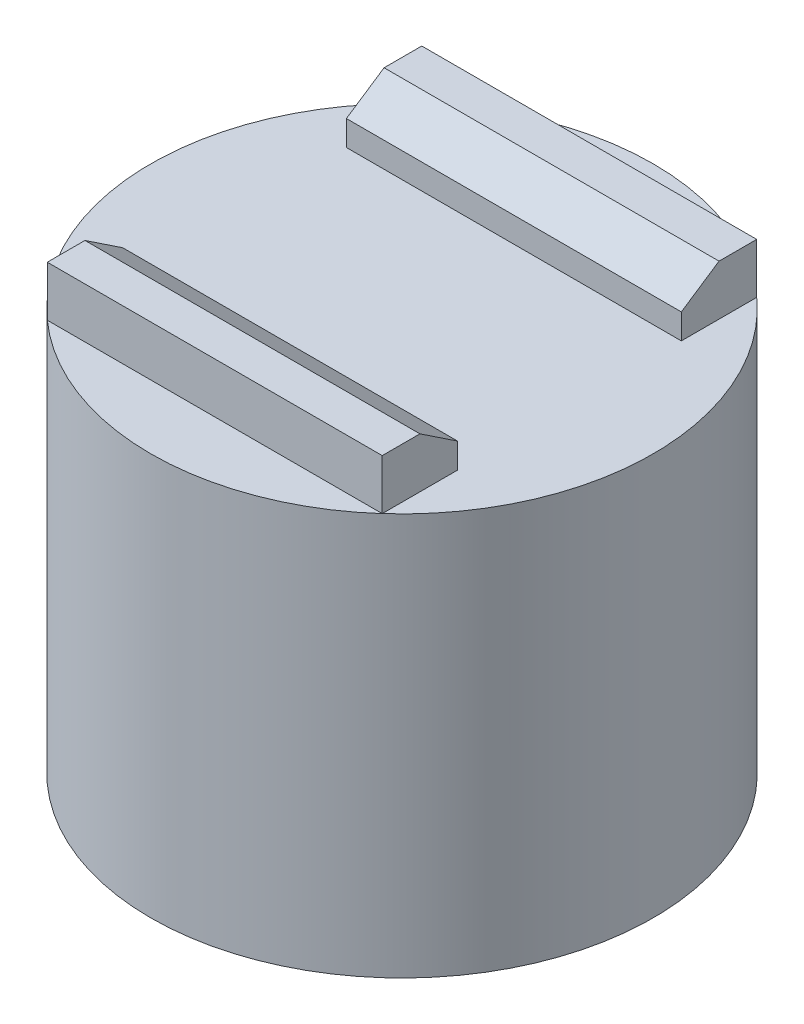
ISO-10303-21;
HEADER;
FILE_DESCRIPTION(('STEP AP214'),'2;1');
FILE_NAME('part.step','',(''),(''),'','','');
FILE_SCHEMA(('AUTOMOTIVE_DESIGN { 1 0 10303 214 1 1 1 1 }'));
ENDSEC;
DATA;
#1=APPLICATION_CONTEXT('core data for automotive mechanical design processes');
#2=APPLICATION_PROTOCOL_DEFINITION('international standard','automotive_design',2000,#1);
#3=PRODUCT_CONTEXT('',#1,'mechanical');
#4=PRODUCT('Part','Part','',(#3));
#5=PRODUCT_RELATED_PRODUCT_CATEGORY('part','',(#4));
#6=PRODUCT_DEFINITION_FORMATION('','',#4);
#7=PRODUCT_DEFINITION_CONTEXT('part definition',#1,'design');
#8=PRODUCT_DEFINITION('design','',#6,#7);
#9=PRODUCT_DEFINITION_SHAPE('','',#8);
#10=(LENGTH_UNIT() NAMED_UNIT(*) SI_UNIT(.MILLI.,.METRE.));
#11=(NAMED_UNIT(*) PLANE_ANGLE_UNIT() SI_UNIT($,.RADIAN.));
#12=(NAMED_UNIT(*) SI_UNIT($,.STERADIAN.) SOLID_ANGLE_UNIT());
#13=UNCERTAINTY_MEASURE_WITH_UNIT(LENGTH_MEASURE(1.E-05),#10,'distance_accuracy_value','');
#14=(GEOMETRIC_REPRESENTATION_CONTEXT(3) GLOBAL_UNCERTAINTY_ASSIGNED_CONTEXT((#13)) GLOBAL_UNIT_ASSIGNED_CONTEXT((#10,
#11,#12)) REPRESENTATION_CONTEXT('',''));
#15=CARTESIAN_POINT('',(0.,0.,0.));
#16=DIRECTION('',(0.,0.,1.));
#17=DIRECTION('',(1.,0.,0.));
#18=AXIS2_PLACEMENT_3D('',#15,#16,#17);
#19=CARTESIAN_POINT('',(0.,24.,0.));
#20=DIRECTION('',(0.,1.,0.));
#21=DIRECTION('',(0.,0.,1.));
#22=AXIS2_PLACEMENT_3D('',#19,#20,#21);
#23=PLANE('',#22);
#24=CARTESIAN_POINT('',(0.,24.,0.));
#25=DIRECTION('',(0.,1.,0.));
#26=DIRECTION('',(0.,0.,1.));
#27=AXIS2_PLACEMENT_3D('',#24,#25,#26);
#28=CIRCLE('',#27,15.);
#29=CARTESIAN_POINT('',(-10.,24.,-11.1803398874989));
#30=VERTEX_POINT('',#29);
#31=CARTESIAN_POINT('',(-10.,24.,11.1803398874989));
#32=VERTEX_POINT('',#31);
#33=EDGE_CURVE('E181',#30,#32,#28,.T.);
#34=ORIENTED_EDGE('',*,*,#33,.T.);
#35=DIRECTION('',(0.,0.,-1.));
#36=VECTOR('',#35,1.);
#37=CARTESIAN_POINT('',(-10.,24.,11.1803398874989));
#38=LINE('',#37,#36);
#39=CARTESIAN_POINT('',(-10.,24.,6.68033988749895));
#40=VERTEX_POINT('',#39);
#41=EDGE_CURVE('E48',#32,#40,#38,.T.);
#42=ORIENTED_EDGE('',*,*,#41,.T.);
#43=DIRECTION('',(1.,0.,0.));
#44=VECTOR('',#43,1.);
#45=CARTESIAN_POINT('',(-10.,24.,6.68033988749895));
#46=LINE('',#45,#44);
#47=CARTESIAN_POINT('',(10.,24.,6.68033988749895));
#48=VERTEX_POINT('',#47);
#49=EDGE_CURVE('E53',#40,#48,#46,.T.);
#50=ORIENTED_EDGE('',*,*,#49,.T.);
#51=DIRECTION('',(0.,0.,-1.));
#52=VECTOR('',#51,1.);
#53=CARTESIAN_POINT('',(10.,24.,11.1803398874989));
#54=LINE('',#53,#52);
#55=CARTESIAN_POINT('',(10.,24.,11.1803398874989));
#56=VERTEX_POINT('',#55);
#57=EDGE_CURVE('E132',#56,#48,#54,.T.);
#58=ORIENTED_EDGE('',*,*,#57,.F.);
#59=CARTESIAN_POINT('',(10.,24.,-11.1803398874989));
#60=VERTEX_POINT('',#59);
#61=EDGE_CURVE('E182',#56,#60,#28,.T.);
#62=ORIENTED_EDGE('',*,*,#61,.T.);
#63=DIRECTION('',(0.,0.,1.));
#64=VECTOR('',#63,1.);
#65=CARTESIAN_POINT('',(10.,24.,-11.1803398874989));
#66=LINE('',#65,#64);
#67=CARTESIAN_POINT('',(10.,24.,-6.68033988749895));
#68=VERTEX_POINT('',#67);
#69=EDGE_CURVE('E165',#60,#68,#66,.T.);
#70=ORIENTED_EDGE('',*,*,#69,.T.);
#71=DIRECTION('',(1.,0.,0.));
#72=VECTOR('',#71,1.);
#73=CARTESIAN_POINT('',(-10.,24.,-6.68033988749895));
#74=LINE('',#73,#72);
#75=CARTESIAN_POINT('',(-10.,24.,-6.68033988749895));
#76=VERTEX_POINT('',#75);
#77=EDGE_CURVE('E162',#76,#68,#74,.T.);
#78=ORIENTED_EDGE('',*,*,#77,.F.);
#79=DIRECTION('',(0.,0.,1.));
#80=VECTOR('',#79,1.);
#81=CARTESIAN_POINT('',(-10.,24.,-11.1803398874989));
#82=LINE('',#81,#80);
#83=EDGE_CURVE('E148',#30,#76,#82,.T.);
#84=ORIENTED_EDGE('',*,*,#83,.F.);
#85=EDGE_LOOP('',(#34,#42,#50,#58,#62,#70,#78,#84));
#86=FACE_BOUND('',#85,.T.);
#87=ADVANCED_FACE('F33',(#86),#23,.T.);
#88=EDGE_CURVE('E41',#60,#30,#28,.T.);
#89=ORIENTED_EDGE('',*,*,#88,.T.);
#90=DIRECTION('',(1.,0.,0.));
#91=VECTOR('',#90,1.);
#92=CARTESIAN_POINT('',(-10.,24.,-11.1803398874989));
#93=LINE('',#92,#91);
#94=EDGE_CURVE('E153',#30,#60,#93,.T.);
#95=ORIENTED_EDGE('',*,*,#94,.T.);
#96=EDGE_LOOP('',(#89,#95));
#97=FACE_BOUND('',#96,.T.);
#98=ADVANCED_FACE('F244',(#97),#23,.T.);
#99=CARTESIAN_POINT('',(0.,24.,0.));
#100=DIRECTION('',(0.,-1.,0.));
#101=DIRECTION('',(0.,0.,-1.));
#102=AXIS2_PLACEMENT_3D('',#99,#100,#101);
#103=CYLINDRICAL_SURFACE('',#102,15.);
#104=ORIENTED_EDGE('',*,*,#88,.F.);
#105=ORIENTED_EDGE('',*,*,#61,.F.);
#106=EDGE_CURVE('E186',#32,#56,#28,.T.);
#107=ORIENTED_EDGE('',*,*,#106,.F.);
#108=ORIENTED_EDGE('',*,*,#33,.F.);
#109=EDGE_LOOP('',(#104,#105,#107,#108));
#110=FACE_BOUND('',#109,.T.);
#111=CARTESIAN_POINT('',(0.,0.,0.));
#112=DIRECTION('',(0.,1.,0.));
#113=DIRECTION('',(0.,0.,1.));
#114=AXIS2_PLACEMENT_3D('',#111,#112,#113);
#115=CIRCLE('',#114,15.);
#116=CARTESIAN_POINT('',(0.,0.,15.));
#117=VERTEX_POINT('',#116);
#118=EDGE_CURVE('E179',#117,#117,#115,.T.);
#119=ORIENTED_EDGE('',*,*,#118,.T.);
#120=EDGE_LOOP('',(#119));
#121=FACE_BOUND('',#120,.T.);
#122=ADVANCED_FACE('F35',(#110,#121),#103,.T.);
#123=DIRECTION('',(1.,0.,0.));
#124=VECTOR('',#123,1.);
#125=CARTESIAN_POINT('',(-10.,24.,11.1803398874989));
#126=LINE('',#125,#124);
#127=EDGE_CURVE('E200',#32,#56,#126,.T.);
#128=ORIENTED_EDGE('',*,*,#127,.F.);
#129=ORIENTED_EDGE('',*,*,#106,.T.);
#130=EDGE_LOOP('',(#128,#129));
#131=FACE_BOUND('',#130,.T.);
#132=ADVANCED_FACE('F235',(#131),#23,.T.);
#133=CARTESIAN_POINT('',(0.,0.,0.));
#134=DIRECTION('',(0.,1.,0.));
#135=DIRECTION('',(0.,0.,1.));
#136=AXIS2_PLACEMENT_3D('',#133,#134,#135);
#137=PLANE('',#136);
#138=CARTESIAN_POINT('',(0.,0.,0.));
#139=DIRECTION('',(0.,-1.,0.));
#140=DIRECTION('',(0.,0.,-1.));
#141=AXIS2_PLACEMENT_3D('',#138,#139,#140);
#142=CIRCLE('',#141,2.5);
#143=CARTESIAN_POINT('',(0.,0.,-2.5));
#144=VERTEX_POINT('',#143);
#145=EDGE_CURVE('E217',#144,#144,#142,.T.);
#146=ORIENTED_EDGE('',*,*,#145,.F.);
#147=EDGE_LOOP('',(#146));
#148=FACE_BOUND('',#147,.T.);
#149=ORIENTED_EDGE('',*,*,#118,.F.);
#150=EDGE_LOOP('',(#149));
#151=FACE_BOUND('',#150,.T.);
#152=ADVANCED_FACE('F231',(#148,#151),#137,.F.);
#153=CARTESIAN_POINT('',(-10.,27.,-11.1803398874989));
#154=DIRECTION('',(1.,0.,0.));
#155=DIRECTION('',(0.,0.,-1.));
#156=AXIS2_PLACEMENT_3D('',#153,#154,#155);
#157=PLANE('',#156);
#158=DIRECTION('',(0.,-1.,0.));
#159=VECTOR('',#158,1.);
#160=CARTESIAN_POINT('',(-10.,27.,-6.68033988749895));
#161=LINE('',#160,#159);
#162=CARTESIAN_POINT('',(-10.,25.5,-6.68033988749896));
#163=VERTEX_POINT('',#162);
#164=EDGE_CURVE('E177',#163,#76,#161,.T.);
#165=ORIENTED_EDGE('',*,*,#164,.F.);
#166=DIRECTION('',(0.,0.554700196225229,-0.832050294337844));
#167=VECTOR('',#166,1.);
#168=CARTESIAN_POINT('',(-10.,28.0384615384615,-10.4880321951913));
#169=LINE('',#168,#167);
#170=CARTESIAN_POINT('',(-10.,27.,-8.93033988749895));
#171=VERTEX_POINT('',#170);
#172=EDGE_CURVE('E145',#163,#171,#169,.T.);
#173=ORIENTED_EDGE('',*,*,#172,.T.);
#174=DIRECTION('',(0.,0.,1.));
#175=VECTOR('',#174,1.);
#176=CARTESIAN_POINT('',(-10.,27.,-11.1803398874989));
#177=LINE('',#176,#175);
#178=CARTESIAN_POINT('',(-10.,27.,-11.1803398874989));
#179=VERTEX_POINT('',#178);
#180=EDGE_CURVE('E149',#179,#171,#177,.T.);
#181=ORIENTED_EDGE('',*,*,#180,.F.);
#182=DIRECTION('',(0.,-1.,0.));
#183=VECTOR('',#182,1.);
#184=CARTESIAN_POINT('',(-10.,27.,-11.1803398874989));
#185=LINE('',#184,#183);
#186=EDGE_CURVE('E159',#179,#30,#185,.T.);
#187=ORIENTED_EDGE('',*,*,#186,.T.);
#188=ORIENTED_EDGE('',*,*,#83,.T.);
#189=EDGE_LOOP('',(#165,#173,#181,#187,#188));
#190=FACE_BOUND('',#189,.T.);
#191=ADVANCED_FACE('F234',(#190),#157,.F.);
#192=CARTESIAN_POINT('',(-10.,27.,-6.68033988749895));
#193=DIRECTION('',(0.,0.,-1.));
#194=DIRECTION('',(-1.,0.,0.));
#195=AXIS2_PLACEMENT_3D('',#192,#193,#194);
#196=PLANE('',#195);
#197=DIRECTION('',(0.,-1.,0.));
#198=VECTOR('',#197,1.);
#199=CARTESIAN_POINT('',(10.,27.,-6.68033988749895));
#200=LINE('',#199,#198);
#201=CARTESIAN_POINT('',(10.,25.5,-6.68033988749895));
#202=VERTEX_POINT('',#201);
#203=EDGE_CURVE('E175',#202,#68,#200,.T.);
#204=ORIENTED_EDGE('',*,*,#203,.F.);
#205=DIRECTION('',(1.,0.,0.));
#206=VECTOR('',#205,1.);
#207=CARTESIAN_POINT('',(-33.,25.5,-6.68033988749896));
#208=LINE('',#207,#206);
#209=EDGE_CURVE('E143',#163,#202,#208,.T.);
#210=ORIENTED_EDGE('',*,*,#209,.F.);
#211=ORIENTED_EDGE('',*,*,#164,.T.);
#212=ORIENTED_EDGE('',*,*,#77,.T.);
#213=EDGE_LOOP('',(#204,#210,#211,#212));
#214=FACE_BOUND('',#213,.T.);
#215=ADVANCED_FACE('F240',(#214),#196,.F.);
#216=CARTESIAN_POINT('',(10.,27.,-11.1803398874989));
#217=DIRECTION('',(1.,0.,0.));
#218=DIRECTION('',(0.,0.,-1.));
#219=AXIS2_PLACEMENT_3D('',#216,#217,#218);
#220=PLANE('',#219);
#221=DIRECTION('',(0.,0.554700196225229,-0.832050294337844));
#222=VECTOR('',#221,1.);
#223=CARTESIAN_POINT('',(10.,25.5,-6.68033988749895));
#224=LINE('',#223,#222);
#225=CARTESIAN_POINT('',(10.,27.,-8.93033988749895));
#226=VERTEX_POINT('',#225);
#227=EDGE_CURVE('E141',#202,#226,#224,.T.);
#228=ORIENTED_EDGE('',*,*,#227,.F.);
#229=ORIENTED_EDGE('',*,*,#203,.T.);
#230=ORIENTED_EDGE('',*,*,#69,.F.);
#231=DIRECTION('',(0.,-1.,0.));
#232=VECTOR('',#231,1.);
#233=CARTESIAN_POINT('',(10.,27.,-11.1803398874989));
#234=LINE('',#233,#232);
#235=CARTESIAN_POINT('',(10.,27.,-11.1803398874989));
#236=VERTEX_POINT('',#235);
#237=EDGE_CURVE('E172',#236,#60,#234,.T.);
#238=ORIENTED_EDGE('',*,*,#237,.F.);
#239=DIRECTION('',(0.,0.,1.));
#240=VECTOR('',#239,1.);
#241=CARTESIAN_POINT('',(10.,27.,-11.1803398874989));
#242=LINE('',#241,#240);
#243=EDGE_CURVE('E152',#236,#226,#242,.T.);
#244=ORIENTED_EDGE('',*,*,#243,.T.);
#245=EDGE_LOOP('',(#228,#229,#230,#238,#244));
#246=FACE_BOUND('',#245,.T.);
#247=ADVANCED_FACE('F253',(#246),#220,.T.);
#248=CARTESIAN_POINT('',(-10.,27.,-11.1803398874989));
#249=DIRECTION('',(0.,0.,-1.));
#250=DIRECTION('',(-1.,0.,0.));
#251=AXIS2_PLACEMENT_3D('',#248,#249,#250);
#252=PLANE('',#251);
#253=ORIENTED_EDGE('',*,*,#94,.F.);
#254=ORIENTED_EDGE('',*,*,#186,.F.);
#255=DIRECTION('',(1.,0.,0.));
#256=VECTOR('',#255,1.);
#257=CARTESIAN_POINT('',(-10.,27.,-11.1803398874989));
#258=LINE('',#257,#256);
#259=EDGE_CURVE('E156',#179,#236,#258,.T.);
#260=ORIENTED_EDGE('',*,*,#259,.T.);
#261=ORIENTED_EDGE('',*,*,#237,.T.);
#262=EDGE_LOOP('',(#253,#254,#260,#261));
#263=FACE_BOUND('',#262,.T.);
#264=ADVANCED_FACE('F257',(#263),#252,.T.);
#265=CARTESIAN_POINT('',(0.,27.,0.));
#266=DIRECTION('',(0.,1.,0.));
#267=DIRECTION('',(0.,0.,1.));
#268=AXIS2_PLACEMENT_3D('',#265,#266,#267);
#269=PLANE('',#268);
#270=DIRECTION('',(-1.,0.,0.));
#271=VECTOR('',#270,1.);
#272=CARTESIAN_POINT('',(0.,27.,-8.93033988749895));
#273=LINE('',#272,#271);
#274=EDGE_CURVE('E11',#226,#171,#273,.T.);
#275=ORIENTED_EDGE('',*,*,#274,.F.);
#276=ORIENTED_EDGE('',*,*,#243,.F.);
#277=ORIENTED_EDGE('',*,*,#259,.F.);
#278=ORIENTED_EDGE('',*,*,#180,.T.);
#279=EDGE_LOOP('',(#275,#276,#277,#278));
#280=FACE_BOUND('',#279,.T.);
#281=ADVANCED_FACE('F261',(#280),#269,.T.);
#282=CARTESIAN_POINT('',(-33.,25.5,-6.68033988749896));
#283=DIRECTION('',(0.,-0.832050294337844,-0.554700196225229));
#284=DIRECTION('',(0.,0.554700196225229,-0.832050294337844));
#285=AXIS2_PLACEMENT_3D('',#282,#283,#284);
#286=PLANE('',#285);
#287=ORIENTED_EDGE('',*,*,#209,.T.);
#288=ORIENTED_EDGE('',*,*,#227,.T.);
#289=ORIENTED_EDGE('',*,*,#274,.T.);
#290=ORIENTED_EDGE('',*,*,#172,.F.);
#291=EDGE_LOOP('',(#287,#288,#289,#290));
#292=FACE_BOUND('',#291,.T.);
#293=ADVANCED_FACE('F265',(#292),#286,.F.);
#294=CARTESIAN_POINT('',(-10.,27.,11.1803398874989));
#295=DIRECTION('',(1.,0.,0.));
#296=DIRECTION('',(0.,0.,1.));
#297=AXIS2_PLACEMENT_3D('',#294,#295,#296);
#298=PLANE('',#297);
#299=DIRECTION('',(0.,-1.,0.));
#300=VECTOR('',#299,1.);
#301=CARTESIAN_POINT('',(-10.,27.,6.68033988749895));
#302=LINE('',#301,#300);
#303=CARTESIAN_POINT('',(-10.,25.5,6.68033988749896));
#304=VERTEX_POINT('',#303);
#305=EDGE_CURVE('E127',#304,#40,#302,.T.);
#306=ORIENTED_EDGE('',*,*,#305,.T.);
#307=ORIENTED_EDGE('',*,*,#41,.F.);
#308=DIRECTION('',(0.,-1.,0.));
#309=VECTOR('',#308,1.);
#310=CARTESIAN_POINT('',(-10.,27.,11.1803398874989));
#311=LINE('',#310,#309);
#312=CARTESIAN_POINT('',(-10.,27.,11.1803398874989));
#313=VERTEX_POINT('',#312);
#314=EDGE_CURVE('E136',#313,#32,#311,.T.);
#315=ORIENTED_EDGE('',*,*,#314,.F.);
#316=DIRECTION('',(0.,0.,-1.));
#317=VECTOR('',#316,1.);
#318=CARTESIAN_POINT('',(-10.,27.,11.1803398874989));
#319=LINE('',#318,#317);
#320=CARTESIAN_POINT('',(-10.,27.,8.93033988749895));
#321=VERTEX_POINT('',#320);
#322=EDGE_CURVE('E213',#313,#321,#319,.T.);
#323=ORIENTED_EDGE('',*,*,#322,.T.);
#324=DIRECTION('',(0.,0.554700196225229,0.832050294337844));
#325=VECTOR('',#324,1.);
#326=CARTESIAN_POINT('',(-10.,28.0384615384615,10.4880321951913));
#327=LINE('',#326,#325);
#328=EDGE_CURVE('E128',#304,#321,#327,.T.);
#329=ORIENTED_EDGE('',*,*,#328,.F.);
#330=EDGE_LOOP('',(#306,#307,#315,#323,#329));
#331=FACE_BOUND('',#330,.T.);
#332=ADVANCED_FACE('F205',(#331),#298,.F.);
#333=CARTESIAN_POINT('',(-10.,27.,6.68033988749895));
#334=DIRECTION('',(0.,0.,1.));
#335=DIRECTION('',(-1.,0.,0.));
#336=AXIS2_PLACEMENT_3D('',#333,#334,#335);
#337=PLANE('',#336);
#338=DIRECTION('',(0.,-1.,0.));
#339=VECTOR('',#338,1.);
#340=CARTESIAN_POINT('',(10.,27.,6.68033988749895));
#341=LINE('',#340,#339);
#342=CARTESIAN_POINT('',(10.,25.5,6.68033988749895));
#343=VERTEX_POINT('',#342);
#344=EDGE_CURVE('E125',#343,#48,#341,.T.);
#345=ORIENTED_EDGE('',*,*,#344,.T.);
#346=ORIENTED_EDGE('',*,*,#49,.F.);
#347=ORIENTED_EDGE('',*,*,#305,.F.);
#348=DIRECTION('',(1.,0.,0.));
#349=VECTOR('',#348,1.);
#350=CARTESIAN_POINT('',(-33.,25.5,6.68033988749896));
#351=LINE('',#350,#349);
#352=EDGE_CURVE('E113',#304,#343,#351,.T.);
#353=ORIENTED_EDGE('',*,*,#352,.T.);
#354=EDGE_LOOP('',(#345,#346,#347,#353));
#355=FACE_BOUND('',#354,.T.);
#356=ADVANCED_FACE('F124',(#355),#337,.F.);
#357=CARTESIAN_POINT('',(10.,27.,11.1803398874989));
#358=DIRECTION('',(1.,0.,0.));
#359=DIRECTION('',(0.,0.,1.));
#360=AXIS2_PLACEMENT_3D('',#357,#358,#359);
#361=PLANE('',#360);
#362=DIRECTION('',(0.,0.554700196225229,0.832050294337844));
#363=VECTOR('',#362,1.);
#364=CARTESIAN_POINT('',(10.,25.5,6.68033988749895));
#365=LINE('',#364,#363);
#366=CARTESIAN_POINT('',(10.,27.,8.93033988749895));
#367=VERTEX_POINT('',#366);
#368=EDGE_CURVE('E109',#343,#367,#365,.T.);
#369=ORIENTED_EDGE('',*,*,#368,.T.);
#370=DIRECTION('',(0.,0.,-1.));
#371=VECTOR('',#370,1.);
#372=CARTESIAN_POINT('',(10.,27.,11.1803398874989));
#373=LINE('',#372,#371);
#374=CARTESIAN_POINT('',(10.,27.,11.1803398874989));
#375=VERTEX_POINT('',#374);
#376=EDGE_CURVE('E214',#375,#367,#373,.T.);
#377=ORIENTED_EDGE('',*,*,#376,.F.);
#378=DIRECTION('',(0.,-1.,0.));
#379=VECTOR('',#378,1.);
#380=CARTESIAN_POINT('',(10.,27.,11.1803398874989));
#381=LINE('',#380,#379);
#382=EDGE_CURVE('E133',#375,#56,#381,.T.);
#383=ORIENTED_EDGE('',*,*,#382,.T.);
#384=ORIENTED_EDGE('',*,*,#57,.T.);
#385=ORIENTED_EDGE('',*,*,#344,.F.);
#386=EDGE_LOOP('',(#369,#377,#383,#384,#385));
#387=FACE_BOUND('',#386,.T.);
#388=ADVANCED_FACE('F130',(#387),#361,.T.);
#389=CARTESIAN_POINT('',(-10.,27.,11.1803398874989));
#390=DIRECTION('',(0.,0.,1.));
#391=DIRECTION('',(-1.,0.,0.));
#392=AXIS2_PLACEMENT_3D('',#389,#390,#391);
#393=PLANE('',#392);
#394=ORIENTED_EDGE('',*,*,#127,.T.);
#395=ORIENTED_EDGE('',*,*,#382,.F.);
#396=DIRECTION('',(1.,0.,0.));
#397=VECTOR('',#396,1.);
#398=CARTESIAN_POINT('',(-10.,27.,11.1803398874989));
#399=LINE('',#398,#397);
#400=EDGE_CURVE('E201',#313,#375,#399,.T.);
#401=ORIENTED_EDGE('',*,*,#400,.F.);
#402=ORIENTED_EDGE('',*,*,#314,.T.);
#403=EDGE_LOOP('',(#394,#395,#401,#402));
#404=FACE_BOUND('',#403,.T.);
#405=ADVANCED_FACE('F198',(#404),#393,.T.);
#406=CARTESIAN_POINT('',(0.,27.,0.));
#407=DIRECTION('',(0.,1.,0.));
#408=DIRECTION('',(0.,0.,-1.));
#409=AXIS2_PLACEMENT_3D('',#406,#407,#408);
#410=PLANE('',#409);
#411=DIRECTION('',(-1.,0.,0.));
#412=VECTOR('',#411,1.);
#413=CARTESIAN_POINT('',(0.,27.,8.93033988749895));
#414=LINE('',#413,#412);
#415=EDGE_CURVE('E115',#367,#321,#414,.T.);
#416=ORIENTED_EDGE('',*,*,#415,.T.);
#417=ORIENTED_EDGE('',*,*,#322,.F.);
#418=ORIENTED_EDGE('',*,*,#400,.T.);
#419=ORIENTED_EDGE('',*,*,#376,.T.);
#420=EDGE_LOOP('',(#416,#417,#418,#419));
#421=FACE_BOUND('',#420,.T.);
#422=ADVANCED_FACE('F278',(#421),#410,.T.);
#423=CARTESIAN_POINT('',(-33.,25.5,6.68033988749896));
#424=DIRECTION('',(0.,-0.832050294337844,0.554700196225229));
#425=DIRECTION('',(0.,0.554700196225229,0.832050294337844));
#426=AXIS2_PLACEMENT_3D('',#423,#424,#425);
#427=PLANE('',#426);
#428=ORIENTED_EDGE('',*,*,#352,.F.);
#429=ORIENTED_EDGE('',*,*,#328,.T.);
#430=ORIENTED_EDGE('',*,*,#415,.F.);
#431=ORIENTED_EDGE('',*,*,#368,.F.);
#432=EDGE_LOOP('',(#428,#429,#430,#431));
#433=FACE_BOUND('',#432,.T.);
#434=ADVANCED_FACE('F111',(#433),#427,.F.);
#435=CARTESIAN_POINT('',(0.,7.,0.));
#436=DIRECTION('',(0.,-1.,0.));
#437=DIRECTION('',(0.,0.,-1.));
#438=AXIS2_PLACEMENT_3D('',#435,#436,#437);
#439=CYLINDRICAL_SURFACE('',#438,2.5);
#440=CARTESIAN_POINT('',(0.,7.,0.));
#441=DIRECTION('',(0.,-1.,0.));
#442=DIRECTION('',(0.,0.,-1.));
#443=AXIS2_PLACEMENT_3D('',#440,#441,#442);
#444=CIRCLE('',#443,2.5);
#445=CARTESIAN_POINT('',(0.,7.,-2.5));
#446=VERTEX_POINT('',#445);
#447=EDGE_CURVE('E120',#446,#446,#444,.T.);
#448=ORIENTED_EDGE('',*,*,#447,.F.);
#449=EDGE_LOOP('',(#448));
#450=FACE_BOUND('',#449,.T.);
#451=ORIENTED_EDGE('',*,*,#145,.T.);
#452=EDGE_LOOP('',(#451));
#453=FACE_BOUND('',#452,.T.);
#454=ADVANCED_FACE('F225',(#450,#453),#439,.F.);
#455=CARTESIAN_POINT('',(0.,7.,0.));
#456=DIRECTION('',(0.,-1.,0.));
#457=DIRECTION('',(0.,0.,-1.));
#458=AXIS2_PLACEMENT_3D('',#455,#456,#457);
#459=PLANE('',#458);
#460=ORIENTED_EDGE('',*,*,#447,.T.);
#461=EDGE_LOOP('',(#460));
#462=FACE_BOUND('',#461,.T.);
#463=ADVANCED_FACE('F223',(#462),#459,.T.);
#464=CLOSED_SHELL('',(#87,#98,#122,#132,#152,#191,#215,#247,#264,#281,#293,#332,#356,#388,#405,
#422,#434,#454,#463));
#465=MANIFOLD_SOLID_BREP('B2',#464);
#466=ADVANCED_BREP_SHAPE_REPRESENTATION('',(#18,#465),#14);
#467=SHAPE_DEFINITION_REPRESENTATION(#9,#466);
ENDSEC;
END-ISO-10303-21;
